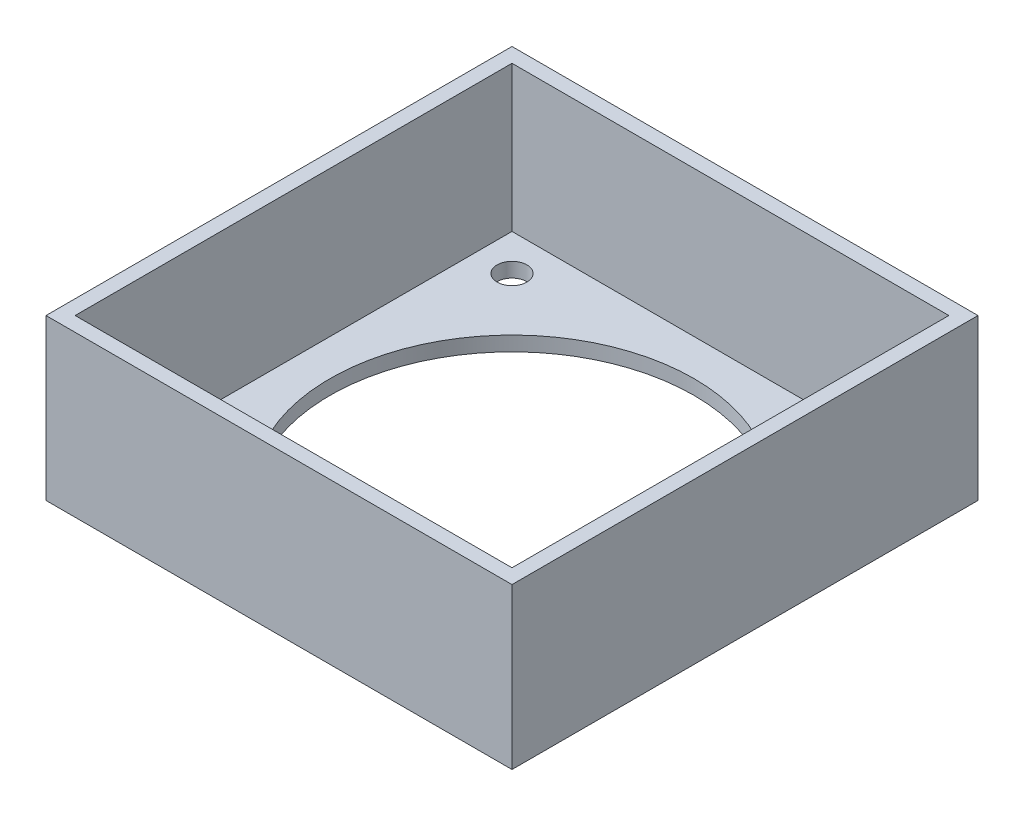
ISO-10303-21;
HEADER;
FILE_DESCRIPTION(('STEP AP214'),'2;1');
FILE_NAME('part.step','',(''),(''),'','','');
FILE_SCHEMA(('AUTOMOTIVE_DESIGN { 1 0 10303 214 1 1 1 1 }'));
ENDSEC;
DATA;
#1=APPLICATION_CONTEXT('core data for automotive mechanical design processes');
#2=APPLICATION_PROTOCOL_DEFINITION('international standard','automotive_design',2000,#1);
#3=PRODUCT_CONTEXT('',#1,'mechanical');
#4=PRODUCT('Part','Part','',(#3));
#5=PRODUCT_RELATED_PRODUCT_CATEGORY('part','',(#4));
#6=PRODUCT_DEFINITION_FORMATION('','',#4);
#7=PRODUCT_DEFINITION_CONTEXT('part definition',#1,'design');
#8=PRODUCT_DEFINITION('design','',#6,#7);
#9=PRODUCT_DEFINITION_SHAPE('','',#8);
#10=(LENGTH_UNIT() NAMED_UNIT(*) SI_UNIT(.MILLI.,.METRE.));
#11=(NAMED_UNIT(*) PLANE_ANGLE_UNIT() SI_UNIT($,.RADIAN.));
#12=(NAMED_UNIT(*) SI_UNIT($,.STERADIAN.) SOLID_ANGLE_UNIT());
#13=UNCERTAINTY_MEASURE_WITH_UNIT(LENGTH_MEASURE(1.E-05),#10,'distance_accuracy_value','');
#14=(GEOMETRIC_REPRESENTATION_CONTEXT(3) GLOBAL_UNCERTAINTY_ASSIGNED_CONTEXT((#13)) GLOBAL_UNIT_ASSIGNED_CONTEXT((#10,
#11,#12)) REPRESENTATION_CONTEXT('',''));
#15=CARTESIAN_POINT('',(0.,0.,0.));
#16=DIRECTION('',(0.,0.,1.));
#17=DIRECTION('',(1.,0.,0.));
#18=AXIS2_PLACEMENT_3D('',#15,#16,#17);
#19=CARTESIAN_POINT('',(-34.8747044917258,22.,-22.0141843971631));
#20=DIRECTION('',(1.,0.,0.));
#21=DIRECTION('',(0.,0.,-1.));
#22=AXIS2_PLACEMENT_3D('',#19,#20,#21);
#23=PLANE('',#22);
#24=DIRECTION('',(0.,0.,1.));
#25=VECTOR('',#24,1.);
#26=CARTESIAN_POINT('',(-34.8747044917258,0.,-22.0141843971631));
#27=LINE('',#26,#25);
#28=CARTESIAN_POINT('',(-34.8747044917258,0.,-22.0141843971631));
#29=VERTEX_POINT('',#28);
#30=CARTESIAN_POINT('',(-34.8747044917258,0.,41.9858156028369));
#31=VERTEX_POINT('',#30);
#32=EDGE_CURVE('E168',#29,#31,#27,.T.);
#33=ORIENTED_EDGE('',*,*,#32,.T.);
#34=DIRECTION('',(0.,-1.,0.));
#35=VECTOR('',#34,1.);
#36=CARTESIAN_POINT('',(-34.8747044917258,22.,41.9858156028369));
#37=LINE('',#36,#35);
#38=CARTESIAN_POINT('',(-34.8747044917258,22.,41.9858156028369));
#39=VERTEX_POINT('',#38);
#40=EDGE_CURVE('E11',#39,#31,#37,.T.);
#41=ORIENTED_EDGE('',*,*,#40,.F.);
#42=DIRECTION('',(0.,0.,1.));
#43=VECTOR('',#42,1.);
#44=CARTESIAN_POINT('',(-34.8747044917258,22.,-22.0141843971631));
#45=LINE('',#44,#43);
#46=CARTESIAN_POINT('',(-34.8747044917258,22.,-22.0141843971631));
#47=VERTEX_POINT('',#46);
#48=EDGE_CURVE('E157',#47,#39,#45,.T.);
#49=ORIENTED_EDGE('',*,*,#48,.F.);
#50=DIRECTION('',(0.,-1.,0.));
#51=VECTOR('',#50,1.);
#52=CARTESIAN_POINT('',(-34.8747044917258,22.,-22.0141843971631));
#53=LINE('',#52,#51);
#54=EDGE_CURVE('E167',#47,#29,#53,.T.);
#55=ORIENTED_EDGE('',*,*,#54,.T.);
#56=EDGE_LOOP('',(#33,#41,#49,#55));
#57=FACE_BOUND('',#56,.T.);
#58=ADVANCED_FACE('F39',(#57),#23,.F.);
#59=CARTESIAN_POINT('',(-34.8747044917258,22.,41.9858156028369));
#60=DIRECTION('',(0.,0.,-1.));
#61=DIRECTION('',(-1.,0.,0.));
#62=AXIS2_PLACEMENT_3D('',#59,#60,#61);
#63=PLANE('',#62);
#64=DIRECTION('',(1.,0.,0.));
#65=VECTOR('',#64,1.);
#66=CARTESIAN_POINT('',(-34.8747044917258,0.,41.9858156028369));
#67=LINE('',#66,#65);
#68=CARTESIAN_POINT('',(29.1252955082742,0.,41.9858156028369));
#69=VERTEX_POINT('',#68);
#70=EDGE_CURVE('E172',#31,#69,#67,.T.);
#71=ORIENTED_EDGE('',*,*,#70,.T.);
#72=DIRECTION('',(0.,-1.,0.));
#73=VECTOR('',#72,1.);
#74=CARTESIAN_POINT('',(29.1252955082742,22.,41.9858156028369));
#75=LINE('',#74,#73);
#76=CARTESIAN_POINT('',(29.1252955082742,22.,41.9858156028369));
#77=VERTEX_POINT('',#76);
#78=EDGE_CURVE('E48',#77,#69,#75,.T.);
#79=ORIENTED_EDGE('',*,*,#78,.F.);
#80=DIRECTION('',(1.,0.,0.));
#81=VECTOR('',#80,1.);
#82=CARTESIAN_POINT('',(-34.8747044917258,22.,41.9858156028369));
#83=LINE('',#82,#81);
#84=EDGE_CURVE('E92',#39,#77,#83,.T.);
#85=ORIENTED_EDGE('',*,*,#84,.F.);
#86=ORIENTED_EDGE('',*,*,#40,.T.);
#87=EDGE_LOOP('',(#71,#79,#85,#86));
#88=FACE_BOUND('',#87,.T.);
#89=ADVANCED_FACE('F208',(#88),#63,.F.);
#90=CARTESIAN_POINT('',(29.1252955082742,22.,-22.0141843971631));
#91=DIRECTION('',(-1.,0.,0.));
#92=DIRECTION('',(0.,0.,1.));
#93=AXIS2_PLACEMENT_3D('',#90,#91,#92);
#94=PLANE('',#93);
#95=DIRECTION('',(0.,0.,-1.));
#96=VECTOR('',#95,1.);
#97=CARTESIAN_POINT('',(29.1252955082742,0.,-22.0141843971631));
#98=LINE('',#97,#96);
#99=CARTESIAN_POINT('',(29.1252955082742,0.,-22.0141843971631));
#100=VERTEX_POINT('',#99);
#101=EDGE_CURVE('E175',#69,#100,#98,.T.);
#102=ORIENTED_EDGE('',*,*,#101,.T.);
#103=DIRECTION('',(0.,-1.,0.));
#104=VECTOR('',#103,1.);
#105=CARTESIAN_POINT('',(29.1252955082742,22.,-22.0141843971631));
#106=LINE('',#105,#104);
#107=CARTESIAN_POINT('',(29.1252955082742,22.,-22.0141843971631));
#108=VERTEX_POINT('',#107);
#109=EDGE_CURVE('E182',#108,#100,#106,.T.);
#110=ORIENTED_EDGE('',*,*,#109,.F.);
#111=DIRECTION('',(0.,0.,-1.));
#112=VECTOR('',#111,1.);
#113=CARTESIAN_POINT('',(29.1252955082742,22.,-22.0141843971631));
#114=LINE('',#113,#112);
#115=EDGE_CURVE('E162',#77,#108,#114,.T.);
#116=ORIENTED_EDGE('',*,*,#115,.F.);
#117=ORIENTED_EDGE('',*,*,#78,.T.);
#118=EDGE_LOOP('',(#102,#110,#116,#117));
#119=FACE_BOUND('',#118,.T.);
#120=ADVANCED_FACE('F190',(#119),#94,.F.);
#121=CARTESIAN_POINT('',(-34.8747044917258,22.,-22.0141843971631));
#122=DIRECTION('',(0.,0.,1.));
#123=DIRECTION('',(1.,0.,0.));
#124=AXIS2_PLACEMENT_3D('',#121,#122,#123);
#125=PLANE('',#124);
#126=DIRECTION('',(-1.,0.,0.));
#127=VECTOR('',#126,1.);
#128=CARTESIAN_POINT('',(-34.8747044917258,0.,-22.0141843971631));
#129=LINE('',#128,#127);
#130=EDGE_CURVE('E85',#100,#29,#129,.T.);
#131=ORIENTED_EDGE('',*,*,#130,.T.);
#132=ORIENTED_EDGE('',*,*,#54,.F.);
#133=DIRECTION('',(-1.,0.,0.));
#134=VECTOR('',#133,1.);
#135=CARTESIAN_POINT('',(-34.8747044917258,22.,-22.0141843971631));
#136=LINE('',#135,#134);
#137=EDGE_CURVE('E64',#108,#47,#136,.T.);
#138=ORIENTED_EDGE('',*,*,#137,.F.);
#139=ORIENTED_EDGE('',*,*,#109,.T.);
#140=EDGE_LOOP('',(#131,#132,#138,#139));
#141=FACE_BOUND('',#140,.T.);
#142=ADVANCED_FACE('F198',(#141),#125,.F.);
#143=CARTESIAN_POINT('',(0.,22.,0.));
#144=DIRECTION('',(0.,1.,0.));
#145=DIRECTION('',(0.,0.,1.));
#146=AXIS2_PLACEMENT_3D('',#143,#144,#145);
#147=PLANE('',#146);
#148=DIRECTION('',(0.,0.,1.));
#149=VECTOR('',#148,1.);
#150=CARTESIAN_POINT('',(-32.8747044917258,22.,-22.0141843971631));
#151=LINE('',#150,#149);
#152=CARTESIAN_POINT('',(-32.8747044917258,22.,-20.0141843971631));
#153=VERTEX_POINT('',#152);
#154=CARTESIAN_POINT('',(-32.8747044917258,22.,39.9858156028369));
#155=VERTEX_POINT('',#154);
#156=EDGE_CURVE('E141',#153,#155,#151,.T.);
#157=ORIENTED_EDGE('',*,*,#156,.F.);
#158=DIRECTION('',(-1.,0.,0.));
#159=VECTOR('',#158,1.);
#160=CARTESIAN_POINT('',(-34.8747044917258,22.,-20.0141843971631));
#161=LINE('',#160,#159);
#162=CARTESIAN_POINT('',(27.1252955082742,22.,-20.0141843971631));
#163=VERTEX_POINT('',#162);
#164=EDGE_CURVE('E154',#163,#153,#161,.T.);
#165=ORIENTED_EDGE('',*,*,#164,.F.);
#166=DIRECTION('',(0.,0.,-1.));
#167=VECTOR('',#166,1.);
#168=CARTESIAN_POINT('',(27.1252955082742,22.,-22.0141843971631));
#169=LINE('',#168,#167);
#170=CARTESIAN_POINT('',(27.1252955082742,22.,39.9858156028369));
#171=VERTEX_POINT('',#170);
#172=EDGE_CURVE('E151',#171,#163,#169,.T.);
#173=ORIENTED_EDGE('',*,*,#172,.F.);
#174=DIRECTION('',(1.,0.,0.));
#175=VECTOR('',#174,1.);
#176=CARTESIAN_POINT('',(-34.8747044917258,22.,39.9858156028369));
#177=LINE('',#176,#175);
#178=EDGE_CURVE('E130',#155,#171,#177,.T.);
#179=ORIENTED_EDGE('',*,*,#178,.F.);
#180=EDGE_LOOP('',(#157,#165,#173,#179));
#181=FACE_BOUND('',#180,.T.);
#182=ORIENTED_EDGE('',*,*,#48,.T.);
#183=ORIENTED_EDGE('',*,*,#84,.T.);
#184=ORIENTED_EDGE('',*,*,#115,.T.);
#185=ORIENTED_EDGE('',*,*,#137,.T.);
#186=EDGE_LOOP('',(#182,#183,#184,#185));
#187=FACE_BOUND('',#186,.T.);
#188=ADVANCED_FACE('F200',(#181,#187),#147,.T.);
#189=CARTESIAN_POINT('',(0.,0.,0.));
#190=DIRECTION('',(0.,1.,0.));
#191=DIRECTION('',(0.,0.,1.));
#192=AXIS2_PLACEMENT_3D('',#189,#190,#191);
#193=PLANE('',#192);
#194=CARTESIAN_POINT('',(22.1252955082742,0.,34.9858156028369));
#195=DIRECTION('',(0.,1.,0.));
#196=DIRECTION('',(0.,0.,1.));
#197=AXIS2_PLACEMENT_3D('',#194,#195,#196);
#198=CIRCLE('',#197,2.05);
#199=CARTESIAN_POINT('',(22.1252955082742,0.,37.0358156028369));
#200=VERTEX_POINT('',#199);
#201=EDGE_CURVE('E343',#200,#200,#198,.T.);
#202=ORIENTED_EDGE('',*,*,#201,.T.);
#203=EDGE_LOOP('',(#202));
#204=FACE_BOUND('',#203,.T.);
#205=CARTESIAN_POINT('',(-27.8747044917258,0.,-15.0141843971631));
#206=DIRECTION('',(0.,1.,0.));
#207=DIRECTION('',(0.,0.,1.));
#208=AXIS2_PLACEMENT_3D('',#205,#206,#207);
#209=CIRCLE('',#208,2.05);
#210=CARTESIAN_POINT('',(-27.8747044917258,0.,-12.9641843971631));
#211=VERTEX_POINT('',#210);
#212=EDGE_CURVE('E346',#211,#211,#209,.T.);
#213=ORIENTED_EDGE('',*,*,#212,.T.);
#214=EDGE_LOOP('',(#213));
#215=FACE_BOUND('',#214,.T.);
#216=CARTESIAN_POINT('',(-27.8747044917258,0.,34.9858156028369));
#217=DIRECTION('',(0.,1.,0.));
#218=DIRECTION('',(0.,0.,1.));
#219=AXIS2_PLACEMENT_3D('',#216,#217,#218);
#220=CIRCLE('',#219,2.05);
#221=CARTESIAN_POINT('',(-27.8747044917258,0.,37.0358156028369));
#222=VERTEX_POINT('',#221);
#223=EDGE_CURVE('E353',#222,#222,#220,.T.);
#224=ORIENTED_EDGE('',*,*,#223,.T.);
#225=EDGE_LOOP('',(#224));
#226=FACE_BOUND('',#225,.T.);
#227=CARTESIAN_POINT('',(22.1252955082742,0.,-15.0141843971631));
#228=DIRECTION('',(0.,1.,0.));
#229=DIRECTION('',(0.,0.,1.));
#230=AXIS2_PLACEMENT_3D('',#227,#228,#229);
#231=CIRCLE('',#230,2.05);
#232=CARTESIAN_POINT('',(22.1252955082742,0.,-12.9641843971631));
#233=VERTEX_POINT('',#232);
#234=EDGE_CURVE('E374',#233,#233,#231,.T.);
#235=ORIENTED_EDGE('',*,*,#234,.T.);
#236=EDGE_LOOP('',(#235));
#237=FACE_BOUND('',#236,.T.);
#238=CARTESIAN_POINT('',(-2.87470449172575,0.,9.98581560283693));
#239=DIRECTION('',(0.,1.,0.));
#240=DIRECTION('',(0.,0.,1.));
#241=AXIS2_PLACEMENT_3D('',#238,#239,#240);
#242=CIRCLE('',#241,25.);
#243=CARTESIAN_POINT('',(-2.87470449172575,0.,34.9858156028369));
#244=VERTEX_POINT('',#243);
#245=EDGE_CURVE('E42',#244,#244,#242,.T.);
#246=ORIENTED_EDGE('',*,*,#245,.T.);
#247=EDGE_LOOP('',(#246));
#248=FACE_BOUND('',#247,.T.);
#249=ORIENTED_EDGE('',*,*,#32,.F.);
#250=ORIENTED_EDGE('',*,*,#130,.F.);
#251=ORIENTED_EDGE('',*,*,#101,.F.);
#252=ORIENTED_EDGE('',*,*,#70,.F.);
#253=EDGE_LOOP('',(#249,#250,#251,#252));
#254=FACE_BOUND('',#253,.T.);
#255=ADVANCED_FACE('F194',(#204,#215,#226,#237,#248,#254),#193,.F.);
#256=CARTESIAN_POINT('',(-32.8747044917258,22.,-22.0141843971631));
#257=DIRECTION('',(1.,0.,0.));
#258=DIRECTION('',(0.,0.,-1.));
#259=AXIS2_PLACEMENT_3D('',#256,#257,#258);
#260=PLANE('',#259);
#261=DIRECTION('',(0.,0.,1.));
#262=VECTOR('',#261,1.);
#263=CARTESIAN_POINT('',(-32.8747044917258,2.,-22.0141843971631));
#264=LINE('',#263,#262);
#265=CARTESIAN_POINT('',(-32.8747044917258,2.,-20.0141843971631));
#266=VERTEX_POINT('',#265);
#267=CARTESIAN_POINT('',(-32.8747044917258,2.,39.9858156028369));
#268=VERTEX_POINT('',#267);
#269=EDGE_CURVE('E120',#266,#268,#264,.T.);
#270=ORIENTED_EDGE('',*,*,#269,.F.);
#271=DIRECTION('',(0.,-1.,0.));
#272=VECTOR('',#271,1.);
#273=CARTESIAN_POINT('',(-32.8747044917258,22.,-20.0141843971631));
#274=LINE('',#273,#272);
#275=EDGE_CURVE('E145',#153,#266,#274,.T.);
#276=ORIENTED_EDGE('',*,*,#275,.F.);
#277=ORIENTED_EDGE('',*,*,#156,.T.);
#278=DIRECTION('',(0.,-1.,0.));
#279=VECTOR('',#278,1.);
#280=CARTESIAN_POINT('',(-32.8747044917258,22.,39.9858156028369));
#281=LINE('',#280,#279);
#282=EDGE_CURVE('E134',#155,#268,#281,.T.);
#283=ORIENTED_EDGE('',*,*,#282,.T.);
#284=EDGE_LOOP('',(#270,#276,#277,#283));
#285=FACE_BOUND('',#284,.T.);
#286=ADVANCED_FACE('F238',(#285),#260,.T.);
#287=CARTESIAN_POINT('',(-34.8747044917258,22.,39.9858156028369));
#288=DIRECTION('',(0.,0.,-1.));
#289=DIRECTION('',(-1.,0.,0.));
#290=AXIS2_PLACEMENT_3D('',#287,#288,#289);
#291=PLANE('',#290);
#292=DIRECTION('',(1.,0.,0.));
#293=VECTOR('',#292,1.);
#294=CARTESIAN_POINT('',(-34.8747044917258,2.,39.9858156028369));
#295=LINE('',#294,#293);
#296=CARTESIAN_POINT('',(27.1252955082742,2.,39.9858156028369));
#297=VERTEX_POINT('',#296);
#298=EDGE_CURVE('E114',#268,#297,#295,.T.);
#299=ORIENTED_EDGE('',*,*,#298,.F.);
#300=ORIENTED_EDGE('',*,*,#282,.F.);
#301=ORIENTED_EDGE('',*,*,#178,.T.);
#302=DIRECTION('',(0.,-1.,0.));
#303=VECTOR('',#302,1.);
#304=CARTESIAN_POINT('',(27.1252955082742,22.,39.9858156028369));
#305=LINE('',#304,#303);
#306=EDGE_CURVE('E127',#171,#297,#305,.T.);
#307=ORIENTED_EDGE('',*,*,#306,.T.);
#308=EDGE_LOOP('',(#299,#300,#301,#307));
#309=FACE_BOUND('',#308,.T.);
#310=ADVANCED_FACE('F128',(#309),#291,.T.);
#311=CARTESIAN_POINT('',(27.1252955082742,22.,-22.0141843971631));
#312=DIRECTION('',(-1.,0.,0.));
#313=DIRECTION('',(0.,0.,1.));
#314=AXIS2_PLACEMENT_3D('',#311,#312,#313);
#315=PLANE('',#314);
#316=DIRECTION('',(0.,0.,-1.));
#317=VECTOR('',#316,1.);
#318=CARTESIAN_POINT('',(27.1252955082742,2.,-22.0141843971631));
#319=LINE('',#318,#317);
#320=CARTESIAN_POINT('',(27.1252955082742,2.,-20.0141843971631));
#321=VERTEX_POINT('',#320);
#322=EDGE_CURVE('E118',#297,#321,#319,.T.);
#323=ORIENTED_EDGE('',*,*,#322,.F.);
#324=ORIENTED_EDGE('',*,*,#306,.F.);
#325=ORIENTED_EDGE('',*,*,#172,.T.);
#326=DIRECTION('',(0.,-1.,0.));
#327=VECTOR('',#326,1.);
#328=CARTESIAN_POINT('',(27.1252955082742,22.,-20.0141843971631));
#329=LINE('',#328,#327);
#330=EDGE_CURVE('E55',#163,#321,#329,.T.);
#331=ORIENTED_EDGE('',*,*,#330,.T.);
#332=EDGE_LOOP('',(#323,#324,#325,#331));
#333=FACE_BOUND('',#332,.T.);
#334=ADVANCED_FACE('F136',(#333),#315,.T.);
#335=CARTESIAN_POINT('',(-34.8747044917258,22.,-20.0141843971631));
#336=DIRECTION('',(0.,0.,1.));
#337=DIRECTION('',(1.,0.,0.));
#338=AXIS2_PLACEMENT_3D('',#335,#336,#337);
#339=PLANE('',#338);
#340=DIRECTION('',(-1.,0.,0.));
#341=VECTOR('',#340,1.);
#342=CARTESIAN_POINT('',(-34.8747044917258,2.,-20.0141843971631));
#343=LINE('',#342,#341);
#344=EDGE_CURVE('E138',#321,#266,#343,.T.);
#345=ORIENTED_EDGE('',*,*,#344,.F.);
#346=ORIENTED_EDGE('',*,*,#330,.F.);
#347=ORIENTED_EDGE('',*,*,#164,.T.);
#348=ORIENTED_EDGE('',*,*,#275,.T.);
#349=EDGE_LOOP('',(#345,#346,#347,#348));
#350=FACE_BOUND('',#349,.T.);
#351=ADVANCED_FACE('F260',(#350),#339,.T.);
#352=CARTESIAN_POINT('',(0.,2.,0.));
#353=DIRECTION('',(0.,1.,0.));
#354=DIRECTION('',(0.,0.,1.));
#355=AXIS2_PLACEMENT_3D('',#352,#353,#354);
#356=PLANE('',#355);
#357=CARTESIAN_POINT('',(22.1252955082742,2.,34.9858156028369));
#358=DIRECTION('',(0.,1.,0.));
#359=DIRECTION('',(0.,0.,1.));
#360=AXIS2_PLACEMENT_3D('',#357,#358,#359);
#361=CIRCLE('',#360,2.05);
#362=CARTESIAN_POINT('',(22.1252955082742,2.,37.0358156028369));
#363=VERTEX_POINT('',#362);
#364=EDGE_CURVE('E340',#363,#363,#361,.T.);
#365=ORIENTED_EDGE('',*,*,#364,.F.);
#366=EDGE_LOOP('',(#365));
#367=FACE_BOUND('',#366,.T.);
#368=CARTESIAN_POINT('',(-27.8747044917258,2.,-15.0141843971631));
#369=DIRECTION('',(0.,1.,0.));
#370=DIRECTION('',(0.,0.,1.));
#371=AXIS2_PLACEMENT_3D('',#368,#369,#370);
#372=CIRCLE('',#371,2.05);
#373=CARTESIAN_POINT('',(-27.8747044917258,2.,-12.9641843971631));
#374=VERTEX_POINT('',#373);
#375=EDGE_CURVE('E385',#374,#374,#372,.T.);
#376=ORIENTED_EDGE('',*,*,#375,.F.);
#377=EDGE_LOOP('',(#376));
#378=FACE_BOUND('',#377,.T.);
#379=CARTESIAN_POINT('',(-27.8747044917258,2.,34.9858156028369));
#380=DIRECTION('',(0.,1.,0.));
#381=DIRECTION('',(0.,0.,1.));
#382=AXIS2_PLACEMENT_3D('',#379,#380,#381);
#383=CIRCLE('',#382,2.05);
#384=CARTESIAN_POINT('',(-27.8747044917258,2.,37.0358156028369));
#385=VERTEX_POINT('',#384);
#386=EDGE_CURVE('E382',#385,#385,#383,.T.);
#387=ORIENTED_EDGE('',*,*,#386,.F.);
#388=EDGE_LOOP('',(#387));
#389=FACE_BOUND('',#388,.T.);
#390=CARTESIAN_POINT('',(22.1252955082742,2.,-15.0141843971631));
#391=DIRECTION('',(0.,1.,0.));
#392=DIRECTION('',(0.,0.,1.));
#393=AXIS2_PLACEMENT_3D('',#390,#391,#392);
#394=CIRCLE('',#393,2.05);
#395=CARTESIAN_POINT('',(22.1252955082742,2.,-12.9641843971631));
#396=VERTEX_POINT('',#395);
#397=EDGE_CURVE('E378',#396,#396,#394,.T.);
#398=ORIENTED_EDGE('',*,*,#397,.F.);
#399=EDGE_LOOP('',(#398));
#400=FACE_BOUND('',#399,.T.);
#401=CARTESIAN_POINT('',(-2.87470449172575,2.,9.98581560283693));
#402=DIRECTION('',(0.,1.,0.));
#403=DIRECTION('',(0.,0.,1.));
#404=AXIS2_PLACEMENT_3D('',#401,#402,#403);
#405=CIRCLE('',#404,25.);
#406=CARTESIAN_POINT('',(-2.87470449172575,2.,34.9858156028369));
#407=VERTEX_POINT('',#406);
#408=EDGE_CURVE('E345',#407,#407,#405,.T.);
#409=ORIENTED_EDGE('',*,*,#408,.F.);
#410=EDGE_LOOP('',(#409));
#411=FACE_BOUND('',#410,.T.);
#412=ORIENTED_EDGE('',*,*,#269,.T.);
#413=ORIENTED_EDGE('',*,*,#298,.T.);
#414=ORIENTED_EDGE('',*,*,#322,.T.);
#415=ORIENTED_EDGE('',*,*,#344,.T.);
#416=EDGE_LOOP('',(#412,#413,#414,#415));
#417=FACE_BOUND('',#416,.T.);
#418=ADVANCED_FACE('F116',(#367,#378,#389,#400,#411,#417),#356,.T.);
#419=CARTESIAN_POINT('',(-2.87470449172575,-20.,9.98581560283693));
#420=DIRECTION('',(0.,1.,0.));
#421=DIRECTION('',(0.,0.,1.));
#422=AXIS2_PLACEMENT_3D('',#419,#420,#421);
#423=CYLINDRICAL_SURFACE('',#422,25.);
#424=ORIENTED_EDGE('',*,*,#408,.T.);
#425=EDGE_LOOP('',(#424));
#426=FACE_BOUND('',#425,.T.);
#427=ORIENTED_EDGE('',*,*,#245,.F.);
#428=EDGE_LOOP('',(#427));
#429=FACE_BOUND('',#428,.T.);
#430=ADVANCED_FACE('F275',(#426,#429),#423,.F.);
#431=CARTESIAN_POINT('',(22.1252955082742,-20.,-15.0141843971631));
#432=DIRECTION('',(0.,1.,0.));
#433=DIRECTION('',(0.,0.,1.));
#434=AXIS2_PLACEMENT_3D('',#431,#432,#433);
#435=CYLINDRICAL_SURFACE('',#434,2.05);
#436=ORIENTED_EDGE('',*,*,#397,.T.);
#437=EDGE_LOOP('',(#436));
#438=FACE_BOUND('',#437,.T.);
#439=ORIENTED_EDGE('',*,*,#234,.F.);
#440=EDGE_LOOP('',(#439));
#441=FACE_BOUND('',#440,.T.);
#442=ADVANCED_FACE('F280',(#438,#441),#435,.F.);
#443=CARTESIAN_POINT('',(-27.8747044917258,-20.,34.9858156028369));
#444=DIRECTION('',(0.,1.,0.));
#445=DIRECTION('',(0.,0.,1.));
#446=AXIS2_PLACEMENT_3D('',#443,#444,#445);
#447=CYLINDRICAL_SURFACE('',#446,2.05);
#448=ORIENTED_EDGE('',*,*,#386,.T.);
#449=EDGE_LOOP('',(#448));
#450=FACE_BOUND('',#449,.T.);
#451=ORIENTED_EDGE('',*,*,#223,.F.);
#452=EDGE_LOOP('',(#451));
#453=FACE_BOUND('',#452,.T.);
#454=ADVANCED_FACE('F303',(#450,#453),#447,.F.);
#455=CARTESIAN_POINT('',(-27.8747044917258,-20.,-15.0141843971631));
#456=DIRECTION('',(0.,1.,0.));
#457=DIRECTION('',(0.,0.,1.));
#458=AXIS2_PLACEMENT_3D('',#455,#456,#457);
#459=CYLINDRICAL_SURFACE('',#458,2.05);
#460=ORIENTED_EDGE('',*,*,#375,.T.);
#461=EDGE_LOOP('',(#460));
#462=FACE_BOUND('',#461,.T.);
#463=ORIENTED_EDGE('',*,*,#212,.F.);
#464=EDGE_LOOP('',(#463));
#465=FACE_BOUND('',#464,.T.);
#466=ADVANCED_FACE('F313',(#462,#465),#459,.F.);
#467=CARTESIAN_POINT('',(22.1252955082742,-20.,34.9858156028369));
#468=DIRECTION('',(0.,1.,0.));
#469=DIRECTION('',(0.,0.,1.));
#470=AXIS2_PLACEMENT_3D('',#467,#468,#469);
#471=CYLINDRICAL_SURFACE('',#470,2.05);
#472=ORIENTED_EDGE('',*,*,#364,.T.);
#473=EDGE_LOOP('',(#472));
#474=FACE_BOUND('',#473,.T.);
#475=ORIENTED_EDGE('',*,*,#201,.F.);
#476=EDGE_LOOP('',(#475));
#477=FACE_BOUND('',#476,.T.);
#478=ADVANCED_FACE('F323',(#474,#477),#471,.F.);
#479=CLOSED_SHELL('',(#58,#89,#120,#142,#188,#255,#286,#310,#334,#351,#418,#430,#442,#454,#466,#478));
#480=MANIFOLD_SOLID_BREP('B2',#479);
#481=ADVANCED_BREP_SHAPE_REPRESENTATION('',(#18,#480),#14);
#482=SHAPE_DEFINITION_REPRESENTATION(#9,#481);
ENDSEC;
END-ISO-10303-21;
